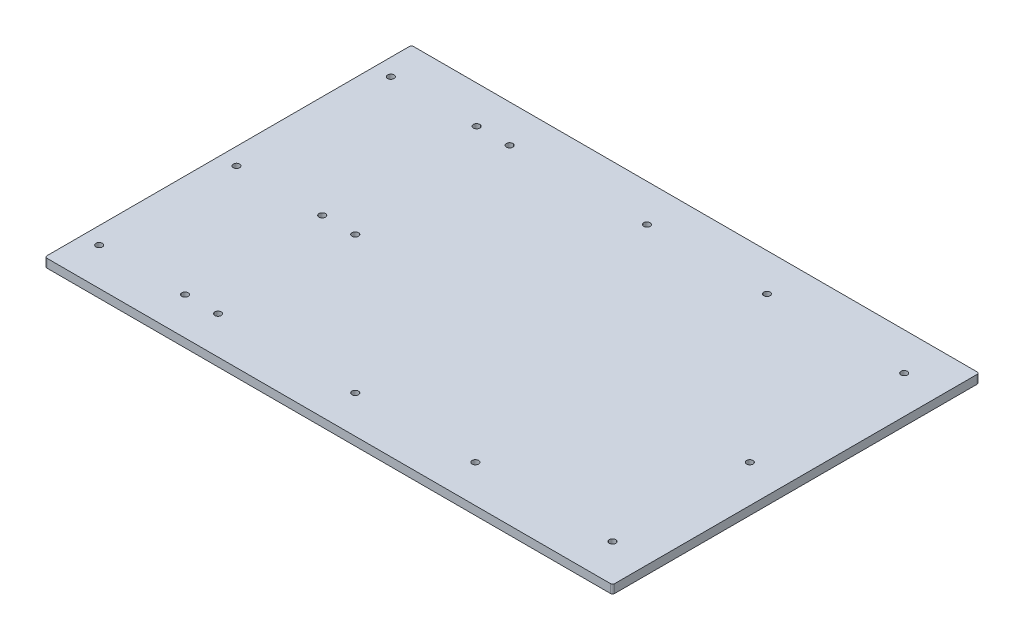
ISO-10303-21;
HEADER;
FILE_DESCRIPTION(('STEP AP214'),'2;1');
FILE_NAME('part.step','',(''),(''),'','','');
FILE_SCHEMA(('AUTOMOTIVE_DESIGN { 1 0 10303 214 1 1 1 1 }'));
ENDSEC;
DATA;
#1=APPLICATION_CONTEXT('core data for automotive mechanical design processes');
#2=APPLICATION_PROTOCOL_DEFINITION('international standard','automotive_design',2000,#1);
#3=PRODUCT_CONTEXT('',#1,'mechanical');
#4=PRODUCT('Part','Part','',(#3));
#5=PRODUCT_RELATED_PRODUCT_CATEGORY('part','',(#4));
#6=PRODUCT_DEFINITION_FORMATION('','',#4);
#7=PRODUCT_DEFINITION_CONTEXT('part definition',#1,'design');
#8=PRODUCT_DEFINITION('design','',#6,#7);
#9=PRODUCT_DEFINITION_SHAPE('','',#8);
#10=(LENGTH_UNIT() NAMED_UNIT(*) SI_UNIT(.MILLI.,.METRE.));
#11=(NAMED_UNIT(*) PLANE_ANGLE_UNIT() SI_UNIT($,.RADIAN.));
#12=(NAMED_UNIT(*) SI_UNIT($,.STERADIAN.) SOLID_ANGLE_UNIT());
#13=UNCERTAINTY_MEASURE_WITH_UNIT(LENGTH_MEASURE(1.E-05),#10,'distance_accuracy_value','');
#14=(GEOMETRIC_REPRESENTATION_CONTEXT(3) GLOBAL_UNCERTAINTY_ASSIGNED_CONTEXT((#13)) GLOBAL_UNIT_ASSIGNED_CONTEXT((#10,
#11,#12)) REPRESENTATION_CONTEXT('',''));
#15=CARTESIAN_POINT('',(0.,0.,0.));
#16=DIRECTION('',(0.,0.,1.));
#17=DIRECTION('',(1.,0.,0.));
#18=AXIS2_PLACEMENT_3D('',#15,#16,#17);
#19=CARTESIAN_POINT('',(-417.195,12.7,-268.2875));
#20=DIRECTION('',(0.,1.,0.));
#21=DIRECTION('',(0.,0.,1.));
#22=AXIS2_PLACEMENT_3D('',#19,#20,#21);
#23=PLANE('',#22);
#24=CARTESIAN_POINT('',(-395.2875,12.7,12.7000000000002));
#25=DIRECTION('',(0.,1.,0.));
#26=DIRECTION('',(0.,0.,-1.));
#27=AXIS2_PLACEMENT_3D('',#24,#25,#26);
#28=CIRCLE('',#27,4.7625);
#29=CARTESIAN_POINT('',(-395.2875,12.7,7.93750000000021));
#30=VERTEX_POINT('',#29);
#31=EDGE_CURVE('E259',#30,#30,#28,.T.);
#32=ORIENTED_EDGE('',*,*,#31,.F.);
#33=EDGE_LOOP('',(#32));
#34=FACE_BOUND('',#33,.T.);
#35=CARTESIAN_POINT('',(-219.3925,12.7,12.7000000000002));
#36=DIRECTION('',(0.,1.,0.));
#37=DIRECTION('',(0.,0.,-1.));
#38=AXIS2_PLACEMENT_3D('',#35,#36,#37);
#39=CIRCLE('',#38,4.7625);
#40=CARTESIAN_POINT('',(-219.3925,12.7,7.93750000000018));
#41=VERTEX_POINT('',#40);
#42=EDGE_CURVE('E247',#41,#41,#39,.T.);
#43=ORIENTED_EDGE('',*,*,#42,.F.);
#44=EDGE_LOOP('',(#43));
#45=FACE_BOUND('',#44,.T.);
#46=CARTESIAN_POINT('',(364.8075,12.7,-215.9));
#47=DIRECTION('',(0.,1.,0.));
#48=DIRECTION('',(0.,0.,1.));
#49=AXIS2_PLACEMENT_3D('',#46,#47,#48);
#50=CIRCLE('',#49,4.7625);
#51=CARTESIAN_POINT('',(364.8075,12.7,-211.1375));
#52=VERTEX_POINT('',#51);
#53=EDGE_CURVE('E235',#52,#52,#50,.T.);
#54=ORIENTED_EDGE('',*,*,#53,.F.);
#55=EDGE_LOOP('',(#54));
#56=FACE_BOUND('',#55,.T.);
#57=CARTESIAN_POINT('',(364.8075,12.7,215.9));
#58=DIRECTION('',(0.,1.,0.));
#59=DIRECTION('',(0.,0.,1.));
#60=AXIS2_PLACEMENT_3D('',#57,#58,#59);
#61=CIRCLE('',#60,4.7625);
#62=CARTESIAN_POINT('',(364.8075,12.7,220.6625));
#63=VERTEX_POINT('',#62);
#64=EDGE_CURVE('E223',#63,#63,#61,.T.);
#65=ORIENTED_EDGE('',*,*,#64,.F.);
#66=EDGE_LOOP('',(#65));
#67=FACE_BOUND('',#66,.T.);
#68=CARTESIAN_POINT('',(-268.2875,12.7,-215.9));
#69=DIRECTION('',(0.,1.,0.));
#70=DIRECTION('',(0.,0.,1.));
#71=AXIS2_PLACEMENT_3D('',#68,#69,#70);
#72=CIRCLE('',#71,4.7625);
#73=CARTESIAN_POINT('',(-268.2875,12.7,-211.1375));
#74=VERTEX_POINT('',#73);
#75=EDGE_CURVE('E211',#74,#74,#72,.T.);
#76=ORIENTED_EDGE('',*,*,#75,.F.);
#77=EDGE_LOOP('',(#76));
#78=FACE_BOUND('',#77,.T.);
#79=CARTESIAN_POINT('',(-268.2875,12.7,215.9));
#80=DIRECTION('',(0.,1.,0.));
#81=DIRECTION('',(0.,0.,1.));
#82=AXIS2_PLACEMENT_3D('',#79,#80,#81);
#83=CIRCLE('',#82,4.7625);
#84=CARTESIAN_POINT('',(-268.2875,12.7,220.6625));
#85=VERTEX_POINT('',#84);
#86=EDGE_CURVE('E199',#85,#85,#83,.T.);
#87=ORIENTED_EDGE('',*,*,#86,.F.);
#88=EDGE_LOOP('',(#87));
#89=FACE_BOUND('',#88,.T.);
#90=CARTESIAN_POINT('',(161.6075,12.7,-215.9));
#91=DIRECTION('',(0.,1.,0.));
#92=DIRECTION('',(0.,0.,1.));
#93=AXIS2_PLACEMENT_3D('',#90,#91,#92);
#94=CIRCLE('',#93,4.7625);
#95=CARTESIAN_POINT('',(161.6075,12.7,-211.1375));
#96=VERTEX_POINT('',#95);
#97=EDGE_CURVE('E187',#96,#96,#94,.T.);
#98=ORIENTED_EDGE('',*,*,#97,.F.);
#99=EDGE_LOOP('',(#98));
#100=FACE_BOUND('',#99,.T.);
#101=CARTESIAN_POINT('',(-16.1925000000001,12.7,215.9));
#102=DIRECTION('',(0.,1.,0.));
#103=DIRECTION('',(0.,0.,1.));
#104=AXIS2_PLACEMENT_3D('',#101,#102,#103);
#105=CIRCLE('',#104,4.7625);
#106=CARTESIAN_POINT('',(-16.1925000000001,12.7,220.6625));
#107=VERTEX_POINT('',#106);
#108=EDGE_CURVE('E133',#107,#107,#105,.T.);
#109=ORIENTED_EDGE('',*,*,#108,.F.);
#110=EDGE_LOOP('',(#109));
#111=FACE_BOUND('',#110,.T.);
#112=CARTESIAN_POINT('',(-417.195,12.7,-268.2875));
#113=DIRECTION('',(0.,1.,0.));
#114=DIRECTION('',(0.,0.,1.));
#115=AXIS2_PLACEMENT_3D('',#112,#113,#114);
#116=CIRCLE('',#115,3.17500000000001);
#117=CARTESIAN_POINT('',(-417.195,12.7,-271.4625));
#118=VERTEX_POINT('',#117);
#119=CARTESIAN_POINT('',(-420.37,12.7,-268.2875));
#120=VERTEX_POINT('',#119);
#121=EDGE_CURVE('E144',#118,#120,#116,.T.);
#122=ORIENTED_EDGE('',*,*,#121,.T.);
#123=DIRECTION('',(0.,0.,1.));
#124=VECTOR('',#123,1.);
#125=CARTESIAN_POINT('',(-420.37,12.7,-268.2875));
#126=LINE('',#125,#124);
#127=CARTESIAN_POINT('',(-420.37,12.7,268.2875));
#128=VERTEX_POINT('',#127);
#129=EDGE_CURVE('E92',#120,#128,#126,.T.);
#130=ORIENTED_EDGE('',*,*,#129,.T.);
#131=CARTESIAN_POINT('',(-417.195,12.7,268.2875));
#132=DIRECTION('',(0.,1.,0.));
#133=DIRECTION('',(0.,0.,1.));
#134=AXIS2_PLACEMENT_3D('',#131,#132,#133);
#135=CIRCLE('',#134,3.17499999999998);
#136=CARTESIAN_POINT('',(-417.195,12.7,271.4625));
#137=VERTEX_POINT('',#136);
#138=EDGE_CURVE('E159',#128,#137,#135,.T.);
#139=ORIENTED_EDGE('',*,*,#138,.T.);
#140=DIRECTION('',(1.,0.,0.));
#141=VECTOR('',#140,1.);
#142=CARTESIAN_POINT('',(-417.195,12.7,271.4625));
#143=LINE('',#142,#141);
#144=CARTESIAN_POINT('',(417.195,12.7,271.4625));
#145=VERTEX_POINT('',#144);
#146=EDGE_CURVE('E172',#137,#145,#143,.T.);
#147=ORIENTED_EDGE('',*,*,#146,.T.);
#148=CARTESIAN_POINT('',(417.195,12.7,268.2875));
#149=DIRECTION('',(0.,1.,0.));
#150=DIRECTION('',(0.,0.,1.));
#151=AXIS2_PLACEMENT_3D('',#148,#149,#150);
#152=CIRCLE('',#151,3.17500000000007);
#153=CARTESIAN_POINT('',(420.37,12.7,268.2875));
#154=VERTEX_POINT('',#153);
#155=EDGE_CURVE('E111',#145,#154,#152,.T.);
#156=ORIENTED_EDGE('',*,*,#155,.T.);
#157=DIRECTION('',(0.,0.,-1.));
#158=VECTOR('',#157,1.);
#159=CARTESIAN_POINT('',(420.37,12.7,268.2875));
#160=LINE('',#159,#158);
#161=CARTESIAN_POINT('',(420.37,12.7,-268.2875));
#162=VERTEX_POINT('',#161);
#163=EDGE_CURVE('E105',#154,#162,#160,.T.);
#164=ORIENTED_EDGE('',*,*,#163,.T.);
#165=CARTESIAN_POINT('',(417.195,12.7,-268.2875));
#166=DIRECTION('',(0.,1.,0.));
#167=DIRECTION('',(0.,0.,1.));
#168=AXIS2_PLACEMENT_3D('',#165,#166,#167);
#169=CIRCLE('',#168,3.17500000000015);
#170=CARTESIAN_POINT('',(417.195,12.7,-271.4625));
#171=VERTEX_POINT('',#170);
#172=EDGE_CURVE('E109',#162,#171,#169,.T.);
#173=ORIENTED_EDGE('',*,*,#172,.T.);
#174=DIRECTION('',(-1.,0.,0.));
#175=VECTOR('',#174,1.);
#176=CARTESIAN_POINT('',(417.195,12.7,-271.4625));
#177=LINE('',#176,#175);
#178=EDGE_CURVE('E49',#171,#118,#177,.T.);
#179=ORIENTED_EDGE('',*,*,#178,.T.);
#180=EDGE_LOOP('',(#122,#130,#139,#147,#156,#164,#173,#179));
#181=FACE_BOUND('',#180,.T.);
#182=CARTESIAN_POINT('',(161.6075,12.7,215.9));
#183=DIRECTION('',(0.,1.,0.));
#184=DIRECTION('',(0.,0.,1.));
#185=AXIS2_PLACEMENT_3D('',#182,#183,#184);
#186=CIRCLE('',#185,4.7625);
#187=CARTESIAN_POINT('',(161.6075,12.7,220.6625));
#188=VERTEX_POINT('',#187);
#189=EDGE_CURVE('E181',#188,#188,#186,.T.);
#190=ORIENTED_EDGE('',*,*,#189,.F.);
#191=EDGE_LOOP('',(#190));
#192=FACE_BOUND('',#191,.T.);
#193=CARTESIAN_POINT('',(-16.1925000000001,12.7,-215.9));
#194=DIRECTION('',(0.,1.,0.));
#195=DIRECTION('',(0.,0.,1.));
#196=AXIS2_PLACEMENT_3D('',#193,#194,#195);
#197=CIRCLE('',#196,4.7625);
#198=CARTESIAN_POINT('',(-16.1925000000001,12.7,-211.1375));
#199=VERTEX_POINT('',#198);
#200=EDGE_CURVE('E193',#199,#199,#197,.T.);
#201=ORIENTED_EDGE('',*,*,#200,.F.);
#202=EDGE_LOOP('',(#201));
#203=FACE_BOUND('',#202,.T.);
#204=CARTESIAN_POINT('',(-395.2875,12.7,215.9));
#205=DIRECTION('',(0.,1.,0.));
#206=DIRECTION('',(0.,0.,1.));
#207=AXIS2_PLACEMENT_3D('',#204,#205,#206);
#208=CIRCLE('',#207,4.7625);
#209=CARTESIAN_POINT('',(-395.2875,12.7,220.6625));
#210=VERTEX_POINT('',#209);
#211=EDGE_CURVE('E205',#210,#210,#208,.T.);
#212=ORIENTED_EDGE('',*,*,#211,.F.);
#213=EDGE_LOOP('',(#212));
#214=FACE_BOUND('',#213,.T.);
#215=CARTESIAN_POINT('',(-395.2875,12.7,-215.9));
#216=DIRECTION('',(0.,1.,0.));
#217=DIRECTION('',(0.,0.,1.));
#218=AXIS2_PLACEMENT_3D('',#215,#216,#217);
#219=CIRCLE('',#218,4.7625);
#220=CARTESIAN_POINT('',(-395.2875,12.7,-211.1375));
#221=VERTEX_POINT('',#220);
#222=EDGE_CURVE('E217',#221,#221,#219,.T.);
#223=ORIENTED_EDGE('',*,*,#222,.F.);
#224=EDGE_LOOP('',(#223));
#225=FACE_BOUND('',#224,.T.);
#226=CARTESIAN_POINT('',(-219.3925,12.7,215.9));
#227=DIRECTION('',(0.,1.,0.));
#228=DIRECTION('',(0.,0.,1.));
#229=AXIS2_PLACEMENT_3D('',#226,#227,#228);
#230=CIRCLE('',#229,4.76250000000003);
#231=CARTESIAN_POINT('',(-219.3925,12.7,220.6625));
#232=VERTEX_POINT('',#231);
#233=EDGE_CURVE('E229',#232,#232,#230,.T.);
#234=ORIENTED_EDGE('',*,*,#233,.F.);
#235=EDGE_LOOP('',(#234));
#236=FACE_BOUND('',#235,.T.);
#237=CARTESIAN_POINT('',(-219.3925,12.7,-215.9));
#238=DIRECTION('',(0.,1.,0.));
#239=DIRECTION('',(0.,0.,1.));
#240=AXIS2_PLACEMENT_3D('',#237,#238,#239);
#241=CIRCLE('',#240,4.7625);
#242=CARTESIAN_POINT('',(-219.3925,12.7,-211.1375));
#243=VERTEX_POINT('',#242);
#244=EDGE_CURVE('E241',#243,#243,#241,.T.);
#245=ORIENTED_EDGE('',*,*,#244,.F.);
#246=EDGE_LOOP('',(#245));
#247=FACE_BOUND('',#246,.T.);
#248=CARTESIAN_POINT('',(364.8075,12.7,12.7000000000001));
#249=DIRECTION('',(0.,1.,0.));
#250=DIRECTION('',(0.,0.,-1.));
#251=AXIS2_PLACEMENT_3D('',#248,#249,#250);
#252=CIRCLE('',#251,4.7625);
#253=CARTESIAN_POINT('',(364.8075,12.7,7.9375000000001));
#254=VERTEX_POINT('',#253);
#255=EDGE_CURVE('E253',#254,#254,#252,.T.);
#256=ORIENTED_EDGE('',*,*,#255,.F.);
#257=EDGE_LOOP('',(#256));
#258=FACE_BOUND('',#257,.T.);
#259=CARTESIAN_POINT('',(-268.2875,12.7,12.7000000000002));
#260=DIRECTION('',(0.,1.,0.));
#261=DIRECTION('',(0.,0.,-1.));
#262=AXIS2_PLACEMENT_3D('',#259,#260,#261);
#263=CIRCLE('',#262,4.7625);
#264=CARTESIAN_POINT('',(-268.2875,12.7,7.93750000000019));
#265=VERTEX_POINT('',#264);
#266=EDGE_CURVE('E265',#265,#265,#263,.T.);
#267=ORIENTED_EDGE('',*,*,#266,.F.);
#268=EDGE_LOOP('',(#267));
#269=FACE_BOUND('',#268,.T.);
#270=ADVANCED_FACE('F32',(#34,#45,#56,#67,#78,#89,#100,#111,#181,#192,#203,#214,#225,#236,#247,
#258,#269),#23,.T.);
#271=CARTESIAN_POINT('',(-417.195,0.,-268.2875));
#272=DIRECTION('',(0.,1.,0.));
#273=DIRECTION('',(0.,0.,1.));
#274=AXIS2_PLACEMENT_3D('',#271,#272,#273);
#275=PLANE('',#274);
#276=CARTESIAN_POINT('',(-395.2875,0.,12.7000000000002));
#277=DIRECTION('',(0.,1.,0.));
#278=DIRECTION('',(0.,0.,-1.));
#279=AXIS2_PLACEMENT_3D('',#276,#277,#278);
#280=CIRCLE('',#279,4.7625);
#281=CARTESIAN_POINT('',(-395.2875,0.,7.93750000000021));
#282=VERTEX_POINT('',#281);
#283=EDGE_CURVE('E262',#282,#282,#280,.T.);
#284=ORIENTED_EDGE('',*,*,#283,.T.);
#285=EDGE_LOOP('',(#284));
#286=FACE_BOUND('',#285,.T.);
#287=CARTESIAN_POINT('',(-219.3925,0.,12.7000000000002));
#288=DIRECTION('',(0.,1.,0.));
#289=DIRECTION('',(0.,0.,-1.));
#290=AXIS2_PLACEMENT_3D('',#287,#288,#289);
#291=CIRCLE('',#290,4.7625);
#292=CARTESIAN_POINT('',(-219.3925,0.,7.93750000000018));
#293=VERTEX_POINT('',#292);
#294=EDGE_CURVE('E250',#293,#293,#291,.T.);
#295=ORIENTED_EDGE('',*,*,#294,.T.);
#296=EDGE_LOOP('',(#295));
#297=FACE_BOUND('',#296,.T.);
#298=CARTESIAN_POINT('',(364.8075,0.,-215.9));
#299=DIRECTION('',(0.,1.,0.));
#300=DIRECTION('',(0.,0.,1.));
#301=AXIS2_PLACEMENT_3D('',#298,#299,#300);
#302=CIRCLE('',#301,4.7625);
#303=CARTESIAN_POINT('',(364.8075,0.,-211.1375));
#304=VERTEX_POINT('',#303);
#305=EDGE_CURVE('E238',#304,#304,#302,.T.);
#306=ORIENTED_EDGE('',*,*,#305,.T.);
#307=EDGE_LOOP('',(#306));
#308=FACE_BOUND('',#307,.T.);
#309=CARTESIAN_POINT('',(364.8075,0.,215.9));
#310=DIRECTION('',(0.,1.,0.));
#311=DIRECTION('',(0.,0.,1.));
#312=AXIS2_PLACEMENT_3D('',#309,#310,#311);
#313=CIRCLE('',#312,4.7625);
#314=CARTESIAN_POINT('',(364.8075,0.,220.6625));
#315=VERTEX_POINT('',#314);
#316=EDGE_CURVE('E226',#315,#315,#313,.T.);
#317=ORIENTED_EDGE('',*,*,#316,.T.);
#318=EDGE_LOOP('',(#317));
#319=FACE_BOUND('',#318,.T.);
#320=CARTESIAN_POINT('',(-268.2875,0.,-215.9));
#321=DIRECTION('',(0.,1.,0.));
#322=DIRECTION('',(0.,0.,1.));
#323=AXIS2_PLACEMENT_3D('',#320,#321,#322);
#324=CIRCLE('',#323,4.7625);
#325=CARTESIAN_POINT('',(-268.2875,0.,-211.1375));
#326=VERTEX_POINT('',#325);
#327=EDGE_CURVE('E214',#326,#326,#324,.T.);
#328=ORIENTED_EDGE('',*,*,#327,.T.);
#329=EDGE_LOOP('',(#328));
#330=FACE_BOUND('',#329,.T.);
#331=CARTESIAN_POINT('',(-268.2875,0.,215.9));
#332=DIRECTION('',(0.,1.,0.));
#333=DIRECTION('',(0.,0.,1.));
#334=AXIS2_PLACEMENT_3D('',#331,#332,#333);
#335=CIRCLE('',#334,4.7625);
#336=CARTESIAN_POINT('',(-268.2875,0.,220.6625));
#337=VERTEX_POINT('',#336);
#338=EDGE_CURVE('E202',#337,#337,#335,.T.);
#339=ORIENTED_EDGE('',*,*,#338,.T.);
#340=EDGE_LOOP('',(#339));
#341=FACE_BOUND('',#340,.T.);
#342=CARTESIAN_POINT('',(161.6075,0.,-215.9));
#343=DIRECTION('',(0.,1.,0.));
#344=DIRECTION('',(0.,0.,1.));
#345=AXIS2_PLACEMENT_3D('',#342,#343,#344);
#346=CIRCLE('',#345,4.7625);
#347=CARTESIAN_POINT('',(161.6075,0.,-211.1375));
#348=VERTEX_POINT('',#347);
#349=EDGE_CURVE('E190',#348,#348,#346,.T.);
#350=ORIENTED_EDGE('',*,*,#349,.T.);
#351=EDGE_LOOP('',(#350));
#352=FACE_BOUND('',#351,.T.);
#353=CARTESIAN_POINT('',(-16.1925000000001,0.,215.9));
#354=DIRECTION('',(0.,1.,0.));
#355=DIRECTION('',(0.,0.,1.));
#356=AXIS2_PLACEMENT_3D('',#353,#354,#355);
#357=CIRCLE('',#356,4.7625);
#358=CARTESIAN_POINT('',(-16.1925000000001,0.,220.6625));
#359=VERTEX_POINT('',#358);
#360=EDGE_CURVE('E178',#359,#359,#357,.T.);
#361=ORIENTED_EDGE('',*,*,#360,.T.);
#362=EDGE_LOOP('',(#361));
#363=FACE_BOUND('',#362,.T.);
#364=CARTESIAN_POINT('',(-417.195,0.,-268.2875));
#365=DIRECTION('',(0.,1.,0.));
#366=DIRECTION('',(0.,0.,1.));
#367=AXIS2_PLACEMENT_3D('',#364,#365,#366);
#368=CIRCLE('',#367,3.17500000000001);
#369=CARTESIAN_POINT('',(-417.195,0.,-271.4625));
#370=VERTEX_POINT('',#369);
#371=CARTESIAN_POINT('',(-420.37,0.,-268.2875));
#372=VERTEX_POINT('',#371);
#373=EDGE_CURVE('E129',#370,#372,#368,.T.);
#374=ORIENTED_EDGE('',*,*,#373,.F.);
#375=DIRECTION('',(-1.,0.,0.));
#376=VECTOR('',#375,1.);
#377=CARTESIAN_POINT('',(417.195,0.,-271.4625));
#378=LINE('',#377,#376);
#379=CARTESIAN_POINT('',(417.195,0.,-271.4625));
#380=VERTEX_POINT('',#379);
#381=EDGE_CURVE('E84',#380,#370,#378,.T.);
#382=ORIENTED_EDGE('',*,*,#381,.F.);
#383=CARTESIAN_POINT('',(417.195,0.,-268.2875));
#384=DIRECTION('',(0.,1.,0.));
#385=DIRECTION('',(0.,0.,1.));
#386=AXIS2_PLACEMENT_3D('',#383,#384,#385);
#387=CIRCLE('',#386,3.17500000000015);
#388=CARTESIAN_POINT('',(420.37,0.,-268.2875));
#389=VERTEX_POINT('',#388);
#390=EDGE_CURVE('E78',#389,#380,#387,.T.);
#391=ORIENTED_EDGE('',*,*,#390,.F.);
#392=DIRECTION('',(0.,0.,-1.));
#393=VECTOR('',#392,1.);
#394=CARTESIAN_POINT('',(420.37,0.,268.2875));
#395=LINE('',#394,#393);
#396=CARTESIAN_POINT('',(420.37,0.,268.2875));
#397=VERTEX_POINT('',#396);
#398=EDGE_CURVE('E119',#397,#389,#395,.T.);
#399=ORIENTED_EDGE('',*,*,#398,.F.);
#400=CARTESIAN_POINT('',(417.195,0.,268.2875));
#401=DIRECTION('',(0.,1.,0.));
#402=DIRECTION('',(0.,0.,1.));
#403=AXIS2_PLACEMENT_3D('',#400,#401,#402);
#404=CIRCLE('',#403,3.17500000000007);
#405=CARTESIAN_POINT('',(417.195,0.,271.4625));
#406=VERTEX_POINT('',#405);
#407=EDGE_CURVE('E139',#406,#397,#404,.T.);
#408=ORIENTED_EDGE('',*,*,#407,.F.);
#409=DIRECTION('',(1.,0.,0.));
#410=VECTOR('',#409,1.);
#411=CARTESIAN_POINT('',(-417.195,0.,271.4625));
#412=LINE('',#411,#410);
#413=CARTESIAN_POINT('',(-417.195,0.,271.4625));
#414=VERTEX_POINT('',#413);
#415=EDGE_CURVE('E137',#414,#406,#412,.T.);
#416=ORIENTED_EDGE('',*,*,#415,.F.);
#417=CARTESIAN_POINT('',(-417.195,0.,268.2875));
#418=DIRECTION('',(0.,1.,0.));
#419=DIRECTION('',(0.,0.,1.));
#420=AXIS2_PLACEMENT_3D('',#417,#418,#419);
#421=CIRCLE('',#420,3.17499999999998);
#422=CARTESIAN_POINT('',(-420.37,0.,268.2875));
#423=VERTEX_POINT('',#422);
#424=EDGE_CURVE('E135',#423,#414,#421,.T.);
#425=ORIENTED_EDGE('',*,*,#424,.F.);
#426=DIRECTION('',(0.,0.,1.));
#427=VECTOR('',#426,1.);
#428=CARTESIAN_POINT('',(-420.37,0.,-268.2875));
#429=LINE('',#428,#427);
#430=EDGE_CURVE('E132',#372,#423,#429,.T.);
#431=ORIENTED_EDGE('',*,*,#430,.F.);
#432=EDGE_LOOP('',(#374,#382,#391,#399,#408,#416,#425,#431));
#433=FACE_BOUND('',#432,.T.);
#434=CARTESIAN_POINT('',(161.6075,0.,215.9));
#435=DIRECTION('',(0.,1.,0.));
#436=DIRECTION('',(0.,0.,1.));
#437=AXIS2_PLACEMENT_3D('',#434,#435,#436);
#438=CIRCLE('',#437,4.7625);
#439=CARTESIAN_POINT('',(161.6075,0.,220.6625));
#440=VERTEX_POINT('',#439);
#441=EDGE_CURVE('E184',#440,#440,#438,.T.);
#442=ORIENTED_EDGE('',*,*,#441,.T.);
#443=EDGE_LOOP('',(#442));
#444=FACE_BOUND('',#443,.T.);
#445=CARTESIAN_POINT('',(-16.1925000000001,0.,-215.9));
#446=DIRECTION('',(0.,1.,0.));
#447=DIRECTION('',(0.,0.,1.));
#448=AXIS2_PLACEMENT_3D('',#445,#446,#447);
#449=CIRCLE('',#448,4.7625);
#450=CARTESIAN_POINT('',(-16.1925000000001,0.,-211.1375));
#451=VERTEX_POINT('',#450);
#452=EDGE_CURVE('E196',#451,#451,#449,.T.);
#453=ORIENTED_EDGE('',*,*,#452,.T.);
#454=EDGE_LOOP('',(#453));
#455=FACE_BOUND('',#454,.T.);
#456=CARTESIAN_POINT('',(-395.2875,0.,215.9));
#457=DIRECTION('',(0.,1.,0.));
#458=DIRECTION('',(0.,0.,1.));
#459=AXIS2_PLACEMENT_3D('',#456,#457,#458);
#460=CIRCLE('',#459,4.7625);
#461=CARTESIAN_POINT('',(-395.2875,0.,220.6625));
#462=VERTEX_POINT('',#461);
#463=EDGE_CURVE('E208',#462,#462,#460,.T.);
#464=ORIENTED_EDGE('',*,*,#463,.T.);
#465=EDGE_LOOP('',(#464));
#466=FACE_BOUND('',#465,.T.);
#467=CARTESIAN_POINT('',(-395.2875,0.,-215.9));
#468=DIRECTION('',(0.,1.,0.));
#469=DIRECTION('',(0.,0.,1.));
#470=AXIS2_PLACEMENT_3D('',#467,#468,#469);
#471=CIRCLE('',#470,4.7625);
#472=CARTESIAN_POINT('',(-395.2875,0.,-211.1375));
#473=VERTEX_POINT('',#472);
#474=EDGE_CURVE('E220',#473,#473,#471,.T.);
#475=ORIENTED_EDGE('',*,*,#474,.T.);
#476=EDGE_LOOP('',(#475));
#477=FACE_BOUND('',#476,.T.);
#478=CARTESIAN_POINT('',(-219.3925,0.,215.9));
#479=DIRECTION('',(0.,1.,0.));
#480=DIRECTION('',(0.,0.,1.));
#481=AXIS2_PLACEMENT_3D('',#478,#479,#480);
#482=CIRCLE('',#481,4.76250000000003);
#483=CARTESIAN_POINT('',(-219.3925,0.,220.6625));
#484=VERTEX_POINT('',#483);
#485=EDGE_CURVE('E232',#484,#484,#482,.T.);
#486=ORIENTED_EDGE('',*,*,#485,.T.);
#487=EDGE_LOOP('',(#486));
#488=FACE_BOUND('',#487,.T.);
#489=CARTESIAN_POINT('',(-219.3925,0.,-215.9));
#490=DIRECTION('',(0.,1.,0.));
#491=DIRECTION('',(0.,0.,1.));
#492=AXIS2_PLACEMENT_3D('',#489,#490,#491);
#493=CIRCLE('',#492,4.7625);
#494=CARTESIAN_POINT('',(-219.3925,0.,-211.1375));
#495=VERTEX_POINT('',#494);
#496=EDGE_CURVE('E244',#495,#495,#493,.T.);
#497=ORIENTED_EDGE('',*,*,#496,.T.);
#498=EDGE_LOOP('',(#497));
#499=FACE_BOUND('',#498,.T.);
#500=CARTESIAN_POINT('',(364.8075,0.,12.7000000000001));
#501=DIRECTION('',(0.,1.,0.));
#502=DIRECTION('',(0.,0.,-1.));
#503=AXIS2_PLACEMENT_3D('',#500,#501,#502);
#504=CIRCLE('',#503,4.7625);
#505=CARTESIAN_POINT('',(364.8075,0.,7.9375000000001));
#506=VERTEX_POINT('',#505);
#507=EDGE_CURVE('E256',#506,#506,#504,.T.);
#508=ORIENTED_EDGE('',*,*,#507,.T.);
#509=EDGE_LOOP('',(#508));
#510=FACE_BOUND('',#509,.T.);
#511=CARTESIAN_POINT('',(-268.2875,0.,12.7000000000002));
#512=DIRECTION('',(0.,1.,0.));
#513=DIRECTION('',(0.,0.,-1.));
#514=AXIS2_PLACEMENT_3D('',#511,#512,#513);
#515=CIRCLE('',#514,4.7625);
#516=CARTESIAN_POINT('',(-268.2875,0.,7.93750000000019));
#517=VERTEX_POINT('',#516);
#518=EDGE_CURVE('E268',#517,#517,#515,.T.);
#519=ORIENTED_EDGE('',*,*,#518,.T.);
#520=EDGE_LOOP('',(#519));
#521=FACE_BOUND('',#520,.T.);
#522=ADVANCED_FACE('F163',(#286,#297,#308,#319,#330,#341,#352,#363,#433,#444,#455,#466,#477,
#488,#499,#510,#521),#275,.F.);
#523=CARTESIAN_POINT('',(-417.195,12.7,-268.2875));
#524=DIRECTION('',(0.,-1.,0.));
#525=DIRECTION('',(0.,0.,-1.));
#526=AXIS2_PLACEMENT_3D('',#523,#524,#525);
#527=CYLINDRICAL_SURFACE('',#526,3.17500000000001);
#528=ORIENTED_EDGE('',*,*,#373,.T.);
#529=DIRECTION('',(0.,-1.,0.));
#530=VECTOR('',#529,1.);
#531=CARTESIAN_POINT('',(-420.37,12.7,-268.2875));
#532=LINE('',#531,#530);
#533=EDGE_CURVE('E11',#120,#372,#532,.T.);
#534=ORIENTED_EDGE('',*,*,#533,.F.);
#535=ORIENTED_EDGE('',*,*,#121,.F.);
#536=DIRECTION('',(0.,-1.,0.));
#537=VECTOR('',#536,1.);
#538=CARTESIAN_POINT('',(-417.195,12.7,-271.4625));
#539=LINE('',#538,#537);
#540=EDGE_CURVE('E125',#118,#370,#539,.T.);
#541=ORIENTED_EDGE('',*,*,#540,.T.);
#542=EDGE_LOOP('',(#528,#534,#535,#541));
#543=FACE_BOUND('',#542,.T.);
#544=ADVANCED_FACE('F34',(#543),#527,.T.);
#545=CARTESIAN_POINT('',(-420.37,12.7,-268.2875));
#546=DIRECTION('',(1.,0.,0.));
#547=DIRECTION('',(0.,0.,-1.));
#548=AXIS2_PLACEMENT_3D('',#545,#546,#547);
#549=PLANE('',#548);
#550=ORIENTED_EDGE('',*,*,#430,.T.);
#551=DIRECTION('',(0.,-1.,0.));
#552=VECTOR('',#551,1.);
#553=CARTESIAN_POINT('',(-420.37,12.7,268.2875));
#554=LINE('',#553,#552);
#555=EDGE_CURVE('E41',#128,#423,#554,.T.);
#556=ORIENTED_EDGE('',*,*,#555,.F.);
#557=ORIENTED_EDGE('',*,*,#129,.F.);
#558=ORIENTED_EDGE('',*,*,#533,.T.);
#559=EDGE_LOOP('',(#550,#556,#557,#558));
#560=FACE_BOUND('',#559,.T.);
#561=ADVANCED_FACE('F303',(#560),#549,.F.);
#562=CARTESIAN_POINT('',(-417.195,12.7,268.2875));
#563=DIRECTION('',(0.,-1.,0.));
#564=DIRECTION('',(0.,0.,-1.));
#565=AXIS2_PLACEMENT_3D('',#562,#563,#564);
#566=CYLINDRICAL_SURFACE('',#565,3.17499999999998);
#567=ORIENTED_EDGE('',*,*,#424,.T.);
#568=DIRECTION('',(0.,-1.,0.));
#569=VECTOR('',#568,1.);
#570=CARTESIAN_POINT('',(-417.195,12.7,271.4625));
#571=LINE('',#570,#569);
#572=EDGE_CURVE('E151',#137,#414,#571,.T.);
#573=ORIENTED_EDGE('',*,*,#572,.F.);
#574=ORIENTED_EDGE('',*,*,#138,.F.);
#575=ORIENTED_EDGE('',*,*,#555,.T.);
#576=EDGE_LOOP('',(#567,#573,#574,#575));
#577=FACE_BOUND('',#576,.T.);
#578=ADVANCED_FACE('F157',(#577),#566,.T.);
#579=CARTESIAN_POINT('',(-417.195,12.7,271.4625));
#580=DIRECTION('',(0.,0.,-1.));
#581=DIRECTION('',(-1.,0.,0.));
#582=AXIS2_PLACEMENT_3D('',#579,#580,#581);
#583=PLANE('',#582);
#584=ORIENTED_EDGE('',*,*,#415,.T.);
#585=DIRECTION('',(0.,-1.,0.));
#586=VECTOR('',#585,1.);
#587=CARTESIAN_POINT('',(417.195,12.7,271.4625));
#588=LINE('',#587,#586);
#589=EDGE_CURVE('E148',#145,#406,#588,.T.);
#590=ORIENTED_EDGE('',*,*,#589,.F.);
#591=ORIENTED_EDGE('',*,*,#146,.F.);
#592=ORIENTED_EDGE('',*,*,#572,.T.);
#593=EDGE_LOOP('',(#584,#590,#591,#592));
#594=FACE_BOUND('',#593,.T.);
#595=ADVANCED_FACE('F168',(#594),#583,.F.);
#596=CARTESIAN_POINT('',(417.195,12.7,268.2875));
#597=DIRECTION('',(0.,-1.,0.));
#598=DIRECTION('',(0.,0.,-1.));
#599=AXIS2_PLACEMENT_3D('',#596,#597,#598);
#600=CYLINDRICAL_SURFACE('',#599,3.17500000000007);
#601=ORIENTED_EDGE('',*,*,#407,.T.);
#602=DIRECTION('',(0.,-1.,0.));
#603=VECTOR('',#602,1.);
#604=CARTESIAN_POINT('',(420.37,12.7,268.2875));
#605=LINE('',#604,#603);
#606=EDGE_CURVE('E120',#154,#397,#605,.T.);
#607=ORIENTED_EDGE('',*,*,#606,.F.);
#608=ORIENTED_EDGE('',*,*,#155,.F.);
#609=ORIENTED_EDGE('',*,*,#589,.T.);
#610=EDGE_LOOP('',(#601,#607,#608,#609));
#611=FACE_BOUND('',#610,.T.);
#612=ADVANCED_FACE('F171',(#611),#600,.T.);
#613=CARTESIAN_POINT('',(420.37,12.7,268.2875));
#614=DIRECTION('',(-1.,0.,0.));
#615=DIRECTION('',(0.,0.,1.));
#616=AXIS2_PLACEMENT_3D('',#613,#614,#615);
#617=PLANE('',#616);
#618=ORIENTED_EDGE('',*,*,#398,.T.);
#619=DIRECTION('',(0.,-1.,0.));
#620=VECTOR('',#619,1.);
#621=CARTESIAN_POINT('',(420.37,12.7,-268.2875));
#622=LINE('',#621,#620);
#623=EDGE_CURVE('E116',#162,#389,#622,.T.);
#624=ORIENTED_EDGE('',*,*,#623,.F.);
#625=ORIENTED_EDGE('',*,*,#163,.F.);
#626=ORIENTED_EDGE('',*,*,#606,.T.);
#627=EDGE_LOOP('',(#618,#624,#625,#626));
#628=FACE_BOUND('',#627,.T.);
#629=ADVANCED_FACE('F117',(#628),#617,.F.);
#630=CARTESIAN_POINT('',(417.195,12.7,-268.2875));
#631=DIRECTION('',(0.,-1.,0.));
#632=DIRECTION('',(0.,0.,-1.));
#633=AXIS2_PLACEMENT_3D('',#630,#631,#632);
#634=CYLINDRICAL_SURFACE('',#633,3.17500000000015);
#635=ORIENTED_EDGE('',*,*,#390,.T.);
#636=DIRECTION('',(0.,-1.,0.));
#637=VECTOR('',#636,1.);
#638=CARTESIAN_POINT('',(417.195,12.7,-271.4625));
#639=LINE('',#638,#637);
#640=EDGE_CURVE('E121',#171,#380,#639,.T.);
#641=ORIENTED_EDGE('',*,*,#640,.F.);
#642=ORIENTED_EDGE('',*,*,#172,.F.);
#643=ORIENTED_EDGE('',*,*,#623,.T.);
#644=EDGE_LOOP('',(#635,#641,#642,#643));
#645=FACE_BOUND('',#644,.T.);
#646=ADVANCED_FACE('F123',(#645),#634,.T.);
#647=CARTESIAN_POINT('',(417.195,12.7,-271.4625));
#648=DIRECTION('',(0.,0.,1.));
#649=DIRECTION('',(1.,0.,0.));
#650=AXIS2_PLACEMENT_3D('',#647,#648,#649);
#651=PLANE('',#650);
#652=ORIENTED_EDGE('',*,*,#381,.T.);
#653=ORIENTED_EDGE('',*,*,#540,.F.);
#654=ORIENTED_EDGE('',*,*,#178,.F.);
#655=ORIENTED_EDGE('',*,*,#640,.T.);
#656=EDGE_LOOP('',(#652,#653,#654,#655));
#657=FACE_BOUND('',#656,.T.);
#658=ADVANCED_FACE('F291',(#657),#651,.F.);
#659=CARTESIAN_POINT('',(-16.1925000000001,12.7,215.9));
#660=DIRECTION('',(0.,-1.,0.));
#661=DIRECTION('',(0.,0.,-1.));
#662=AXIS2_PLACEMENT_3D('',#659,#660,#661);
#663=CYLINDRICAL_SURFACE('',#662,4.7625);
#664=ORIENTED_EDGE('',*,*,#108,.T.);
#665=EDGE_LOOP('',(#664));
#666=FACE_BOUND('',#665,.T.);
#667=ORIENTED_EDGE('',*,*,#360,.F.);
#668=EDGE_LOOP('',(#667));
#669=FACE_BOUND('',#668,.T.);
#670=ADVANCED_FACE('F288',(#666,#669),#663,.F.);
#671=CARTESIAN_POINT('',(161.6075,12.7,215.9));
#672=DIRECTION('',(0.,-1.,0.));
#673=DIRECTION('',(0.,0.,-1.));
#674=AXIS2_PLACEMENT_3D('',#671,#672,#673);
#675=CYLINDRICAL_SURFACE('',#674,4.7625);
#676=ORIENTED_EDGE('',*,*,#189,.T.);
#677=EDGE_LOOP('',(#676));
#678=FACE_BOUND('',#677,.T.);
#679=ORIENTED_EDGE('',*,*,#441,.F.);
#680=EDGE_LOOP('',(#679));
#681=FACE_BOUND('',#680,.T.);
#682=ADVANCED_FACE('F367',(#678,#681),#675,.F.);
#683=CARTESIAN_POINT('',(161.6075,12.7,-215.9));
#684=DIRECTION('',(0.,-1.,0.));
#685=DIRECTION('',(0.,0.,-1.));
#686=AXIS2_PLACEMENT_3D('',#683,#684,#685);
#687=CYLINDRICAL_SURFACE('',#686,4.7625);
#688=ORIENTED_EDGE('',*,*,#97,.T.);
#689=EDGE_LOOP('',(#688));
#690=FACE_BOUND('',#689,.T.);
#691=ORIENTED_EDGE('',*,*,#349,.F.);
#692=EDGE_LOOP('',(#691));
#693=FACE_BOUND('',#692,.T.);
#694=ADVANCED_FACE('F375',(#690,#693),#687,.F.);
#695=CARTESIAN_POINT('',(-16.1925000000001,12.7,-215.9));
#696=DIRECTION('',(0.,-1.,0.));
#697=DIRECTION('',(0.,0.,-1.));
#698=AXIS2_PLACEMENT_3D('',#695,#696,#697);
#699=CYLINDRICAL_SURFACE('',#698,4.7625);
#700=ORIENTED_EDGE('',*,*,#200,.T.);
#701=EDGE_LOOP('',(#700));
#702=FACE_BOUND('',#701,.T.);
#703=ORIENTED_EDGE('',*,*,#452,.F.);
#704=EDGE_LOOP('',(#703));
#705=FACE_BOUND('',#704,.T.);
#706=ADVANCED_FACE('F383',(#702,#705),#699,.F.);
#707=CARTESIAN_POINT('',(-268.2875,12.7,215.9));
#708=DIRECTION('',(0.,-1.,0.));
#709=DIRECTION('',(0.,0.,-1.));
#710=AXIS2_PLACEMENT_3D('',#707,#708,#709);
#711=CYLINDRICAL_SURFACE('',#710,4.7625);
#712=ORIENTED_EDGE('',*,*,#86,.T.);
#713=EDGE_LOOP('',(#712));
#714=FACE_BOUND('',#713,.T.);
#715=ORIENTED_EDGE('',*,*,#338,.F.);
#716=EDGE_LOOP('',(#715));
#717=FACE_BOUND('',#716,.T.);
#718=ADVANCED_FACE('F392',(#714,#717),#711,.F.);
#719=CARTESIAN_POINT('',(-395.2875,12.7,215.9));
#720=DIRECTION('',(0.,-1.,0.));
#721=DIRECTION('',(0.,0.,-1.));
#722=AXIS2_PLACEMENT_3D('',#719,#720,#721);
#723=CYLINDRICAL_SURFACE('',#722,4.7625);
#724=ORIENTED_EDGE('',*,*,#211,.T.);
#725=EDGE_LOOP('',(#724));
#726=FACE_BOUND('',#725,.T.);
#727=ORIENTED_EDGE('',*,*,#463,.F.);
#728=EDGE_LOOP('',(#727));
#729=FACE_BOUND('',#728,.T.);
#730=ADVANCED_FACE('F401',(#726,#729),#723,.F.);
#731=CARTESIAN_POINT('',(-268.2875,12.7,-215.9));
#732=DIRECTION('',(0.,-1.,0.));
#733=DIRECTION('',(0.,0.,-1.));
#734=AXIS2_PLACEMENT_3D('',#731,#732,#733);
#735=CYLINDRICAL_SURFACE('',#734,4.7625);
#736=ORIENTED_EDGE('',*,*,#75,.T.);
#737=EDGE_LOOP('',(#736));
#738=FACE_BOUND('',#737,.T.);
#739=ORIENTED_EDGE('',*,*,#327,.F.);
#740=EDGE_LOOP('',(#739));
#741=FACE_BOUND('',#740,.T.);
#742=ADVANCED_FACE('F410',(#738,#741),#735,.F.);
#743=CARTESIAN_POINT('',(-395.2875,12.7,-215.9));
#744=DIRECTION('',(0.,-1.,0.));
#745=DIRECTION('',(0.,0.,-1.));
#746=AXIS2_PLACEMENT_3D('',#743,#744,#745);
#747=CYLINDRICAL_SURFACE('',#746,4.7625);
#748=ORIENTED_EDGE('',*,*,#222,.T.);
#749=EDGE_LOOP('',(#748));
#750=FACE_BOUND('',#749,.T.);
#751=ORIENTED_EDGE('',*,*,#474,.F.);
#752=EDGE_LOOP('',(#751));
#753=FACE_BOUND('',#752,.T.);
#754=ADVANCED_FACE('F419',(#750,#753),#747,.F.);
#755=CARTESIAN_POINT('',(364.8075,12.7,215.9));
#756=DIRECTION('',(0.,-1.,0.));
#757=DIRECTION('',(0.,0.,-1.));
#758=AXIS2_PLACEMENT_3D('',#755,#756,#757);
#759=CYLINDRICAL_SURFACE('',#758,4.7625);
#760=ORIENTED_EDGE('',*,*,#64,.T.);
#761=EDGE_LOOP('',(#760));
#762=FACE_BOUND('',#761,.T.);
#763=ORIENTED_EDGE('',*,*,#316,.F.);
#764=EDGE_LOOP('',(#763));
#765=FACE_BOUND('',#764,.T.);
#766=ADVANCED_FACE('F428',(#762,#765),#759,.F.);
#767=CARTESIAN_POINT('',(-219.3925,12.7,215.9));
#768=DIRECTION('',(0.,-1.,0.));
#769=DIRECTION('',(0.,0.,-1.));
#770=AXIS2_PLACEMENT_3D('',#767,#768,#769);
#771=CYLINDRICAL_SURFACE('',#770,4.76250000000003);
#772=ORIENTED_EDGE('',*,*,#233,.T.);
#773=EDGE_LOOP('',(#772));
#774=FACE_BOUND('',#773,.T.);
#775=ORIENTED_EDGE('',*,*,#485,.F.);
#776=EDGE_LOOP('',(#775));
#777=FACE_BOUND('',#776,.T.);
#778=ADVANCED_FACE('F437',(#774,#777),#771,.F.);
#779=CARTESIAN_POINT('',(364.8075,12.7,-215.9));
#780=DIRECTION('',(0.,-1.,0.));
#781=DIRECTION('',(0.,0.,-1.));
#782=AXIS2_PLACEMENT_3D('',#779,#780,#781);
#783=CYLINDRICAL_SURFACE('',#782,4.7625);
#784=ORIENTED_EDGE('',*,*,#53,.T.);
#785=EDGE_LOOP('',(#784));
#786=FACE_BOUND('',#785,.T.);
#787=ORIENTED_EDGE('',*,*,#305,.F.);
#788=EDGE_LOOP('',(#787));
#789=FACE_BOUND('',#788,.T.);
#790=ADVANCED_FACE('F446',(#786,#789),#783,.F.);
#791=CARTESIAN_POINT('',(-219.3925,12.7,-215.9));
#792=DIRECTION('',(0.,-1.,0.));
#793=DIRECTION('',(0.,0.,-1.));
#794=AXIS2_PLACEMENT_3D('',#791,#792,#793);
#795=CYLINDRICAL_SURFACE('',#794,4.7625);
#796=ORIENTED_EDGE('',*,*,#244,.T.);
#797=EDGE_LOOP('',(#796));
#798=FACE_BOUND('',#797,.T.);
#799=ORIENTED_EDGE('',*,*,#496,.F.);
#800=EDGE_LOOP('',(#799));
#801=FACE_BOUND('',#800,.T.);
#802=ADVANCED_FACE('F455',(#798,#801),#795,.F.);
#803=CARTESIAN_POINT('',(-219.3925,12.7,12.7000000000002));
#804=DIRECTION('',(0.,-1.,0.));
#805=DIRECTION('',(0.,0.,-1.));
#806=AXIS2_PLACEMENT_3D('',#803,#804,#805);
#807=CYLINDRICAL_SURFACE('',#806,4.7625);
#808=ORIENTED_EDGE('',*,*,#42,.T.);
#809=EDGE_LOOP('',(#808));
#810=FACE_BOUND('',#809,.T.);
#811=ORIENTED_EDGE('',*,*,#294,.F.);
#812=EDGE_LOOP('',(#811));
#813=FACE_BOUND('',#812,.T.);
#814=ADVANCED_FACE('F464',(#810,#813),#807,.F.);
#815=CARTESIAN_POINT('',(364.8075,12.7,12.7000000000001));
#816=DIRECTION('',(0.,-1.,0.));
#817=DIRECTION('',(0.,0.,-1.));
#818=AXIS2_PLACEMENT_3D('',#815,#816,#817);
#819=CYLINDRICAL_SURFACE('',#818,4.7625);
#820=ORIENTED_EDGE('',*,*,#255,.T.);
#821=EDGE_LOOP('',(#820));
#822=FACE_BOUND('',#821,.T.);
#823=ORIENTED_EDGE('',*,*,#507,.F.);
#824=EDGE_LOOP('',(#823));
#825=FACE_BOUND('',#824,.T.);
#826=ADVANCED_FACE('F473',(#822,#825),#819,.F.);
#827=CARTESIAN_POINT('',(-395.2875,12.7,12.7000000000002));
#828=DIRECTION('',(0.,-1.,0.));
#829=DIRECTION('',(0.,0.,-1.));
#830=AXIS2_PLACEMENT_3D('',#827,#828,#829);
#831=CYLINDRICAL_SURFACE('',#830,4.7625);
#832=ORIENTED_EDGE('',*,*,#31,.T.);
#833=EDGE_LOOP('',(#832));
#834=FACE_BOUND('',#833,.T.);
#835=ORIENTED_EDGE('',*,*,#283,.F.);
#836=EDGE_LOOP('',(#835));
#837=FACE_BOUND('',#836,.T.);
#838=ADVANCED_FACE('F482',(#834,#837),#831,.F.);
#839=CARTESIAN_POINT('',(-268.2875,12.7,12.7000000000002));
#840=DIRECTION('',(0.,-1.,0.));
#841=DIRECTION('',(0.,0.,-1.));
#842=AXIS2_PLACEMENT_3D('',#839,#840,#841);
#843=CYLINDRICAL_SURFACE('',#842,4.7625);
#844=ORIENTED_EDGE('',*,*,#266,.T.);
#845=EDGE_LOOP('',(#844));
#846=FACE_BOUND('',#845,.T.);
#847=ORIENTED_EDGE('',*,*,#518,.F.);
#848=EDGE_LOOP('',(#847));
#849=FACE_BOUND('',#848,.T.);
#850=ADVANCED_FACE('F274',(#846,#849),#843,.F.);
#851=CLOSED_SHELL('',(#270,#522,#544,#561,#578,#595,#612,#629,#646,#658,#670,#682,#694,#706,
#718,#730,#742,#754,#766,#778,#790,#802,#814,#826,#838,#850));
#852=MANIFOLD_SOLID_BREP('B2',#851);
#853=ADVANCED_BREP_SHAPE_REPRESENTATION('',(#18,#852),#14);
#854=SHAPE_DEFINITION_REPRESENTATION(#9,#853);
ENDSEC;
END-ISO-10303-21;
